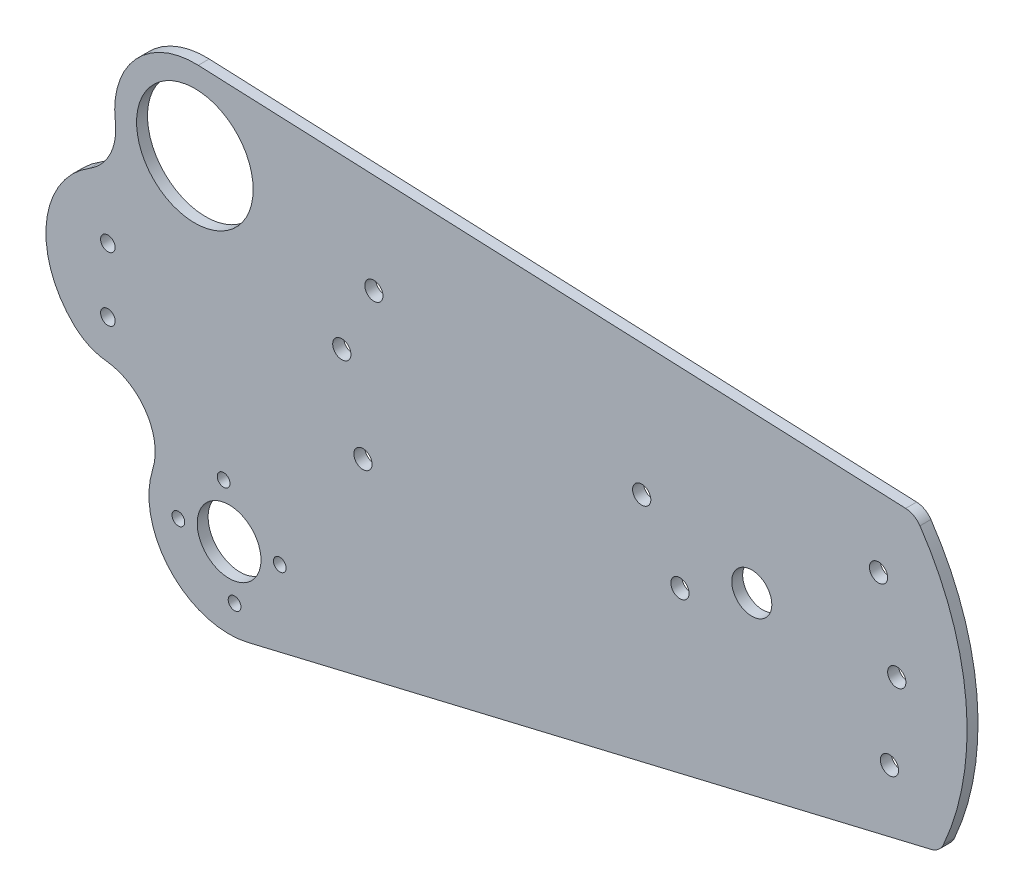
ISO-10303-21;
HEADER;
FILE_DESCRIPTION(('STEP AP214'),'2;1');
FILE_NAME('part.step','',(''),(''),'','','');
FILE_SCHEMA(('AUTOMOTIVE_DESIGN { 1 0 10303 214 1 1 1 1 }'));
ENDSEC;
DATA;
#1=APPLICATION_CONTEXT('core data for automotive mechanical design processes');
#2=APPLICATION_PROTOCOL_DEFINITION('international standard','automotive_design',2000,#1);
#3=PRODUCT_CONTEXT('',#1,'mechanical');
#4=PRODUCT('Part','Part','',(#3));
#5=PRODUCT_RELATED_PRODUCT_CATEGORY('part','',(#4));
#6=PRODUCT_DEFINITION_FORMATION('','',#4);
#7=PRODUCT_DEFINITION_CONTEXT('part definition',#1,'design');
#8=PRODUCT_DEFINITION('design','',#6,#7);
#9=PRODUCT_DEFINITION_SHAPE('','',#8);
#10=(LENGTH_UNIT() NAMED_UNIT(*) SI_UNIT(.MILLI.,.METRE.));
#11=(NAMED_UNIT(*) PLANE_ANGLE_UNIT() SI_UNIT($,.RADIAN.));
#12=(NAMED_UNIT(*) SI_UNIT($,.STERADIAN.) SOLID_ANGLE_UNIT());
#13=UNCERTAINTY_MEASURE_WITH_UNIT(LENGTH_MEASURE(1.E-05),#10,'distance_accuracy_value','');
#14=(GEOMETRIC_REPRESENTATION_CONTEXT(3) GLOBAL_UNCERTAINTY_ASSIGNED_CONTEXT((#13)) GLOBAL_UNIT_ASSIGNED_CONTEXT((#10,
#11,#12)) REPRESENTATION_CONTEXT('',''));
#15=CARTESIAN_POINT('',(0.,0.,0.));
#16=DIRECTION('',(0.,0.,1.));
#17=DIRECTION('',(1.,0.,0.));
#18=AXIS2_PLACEMENT_3D('',#15,#16,#17);
#19=CARTESIAN_POINT('',(1.89075570106414,44.5872079271914,3.));
#20=DIRECTION('',(0.0423677115411601,0.999102085384054,0.));
#21=DIRECTION('',(-0.999102085384054,0.0423677115411601,0.));
#22=AXIS2_PLACEMENT_3D('',#19,#20,#21);
#23=PLANE('',#22);
#24=DIRECTION('',(0.999102085384054,-0.0423677115411601,0.));
#25=VECTOR('',#24,1.);
#26=CARTESIAN_POINT('',(1.89075570106414,44.5872079271914,0.));
#27=LINE('',#26,#25);
#28=CARTESIAN_POINT('',(-113.495330616477,49.4802458784491,0.));
#29=VERTEX_POINT('',#28);
#30=CARTESIAN_POINT('',(80.6427526251226,41.247667415987,0.));
#31=VERTEX_POINT('',#30);
#32=EDGE_CURVE('E226',#29,#31,#27,.T.);
#33=ORIENTED_EDGE('',*,*,#32,.F.);
#34=DIRECTION('',(0.,0.,-1.));
#35=VECTOR('',#34,1.);
#36=CARTESIAN_POINT('',(-113.495330616477,49.4802458784491,3.));
#37=LINE('',#36,#35);
#38=CARTESIAN_POINT('',(-113.495330616477,49.4802458784491,3.));
#39=VERTEX_POINT('',#38);
#40=EDGE_CURVE('E11',#39,#29,#37,.T.);
#41=ORIENTED_EDGE('',*,*,#40,.F.);
#42=DIRECTION('',(0.999102085384054,-0.0423677115411601,0.));
#43=VECTOR('',#42,1.);
#44=CARTESIAN_POINT('',(1.89075570106414,44.5872079271914,3.));
#45=LINE('',#44,#43);
#46=CARTESIAN_POINT('',(80.6427526251226,41.247667415987,3.));
#47=VERTEX_POINT('',#46);
#48=EDGE_CURVE('E330',#39,#47,#45,.T.);
#49=ORIENTED_EDGE('',*,*,#48,.T.);
#50=DIRECTION('',(0.,0.,-1.));
#51=VECTOR('',#50,1.);
#52=CARTESIAN_POINT('',(80.6427526251226,41.247667415987,3.));
#53=LINE('',#52,#51);
#54=EDGE_CURVE('E102',#47,#31,#53,.T.);
#55=ORIENTED_EDGE('',*,*,#54,.T.);
#56=EDGE_LOOP('',(#33,#41,#49,#55));
#57=FACE_BOUND('',#56,.T.);
#58=ADVANCED_FACE('F41',(#57),#23,.T.);
#59=CARTESIAN_POINT('',(-114.427420270382,27.5,3.));
#60=DIRECTION('',(0.,0.,-1.));
#61=DIRECTION('',(-1.,0.,0.));
#62=AXIS2_PLACEMENT_3D('',#59,#60,#61);
#63=CYLINDRICAL_SURFACE('',#62,22.);
#64=CARTESIAN_POINT('',(-114.427420270382,27.5,0.));
#65=DIRECTION('',(0.,0.,1.));
#66=DIRECTION('',(1.,0.,0.));
#67=AXIS2_PLACEMENT_3D('',#64,#65,#66);
#68=CIRCLE('',#67,22.);
#69=CARTESIAN_POINT('',(-136.255917019938,24.7583345108093,0.));
#70=VERTEX_POINT('',#69);
#71=EDGE_CURVE('E230',#29,#70,#68,.T.);
#72=ORIENTED_EDGE('',*,*,#71,.T.);
#73=DIRECTION('',(0.,0.,-1.));
#74=VECTOR('',#73,1.);
#75=CARTESIAN_POINT('',(-136.255917019938,24.7583345108093,3.));
#76=LINE('',#75,#74);
#77=CARTESIAN_POINT('',(-136.255917019938,24.7583345108093,3.));
#78=VERTEX_POINT('',#77);
#79=EDGE_CURVE('E50',#78,#70,#76,.T.);
#80=ORIENTED_EDGE('',*,*,#79,.F.);
#81=CARTESIAN_POINT('',(-114.427420270382,27.5,3.));
#82=DIRECTION('',(0.,0.,1.));
#83=DIRECTION('',(1.,0.,0.));
#84=AXIS2_PLACEMENT_3D('',#81,#82,#83);
#85=CIRCLE('',#84,22.);
#86=EDGE_CURVE('E405',#39,#78,#85,.T.);
#87=ORIENTED_EDGE('',*,*,#86,.F.);
#88=ORIENTED_EDGE('',*,*,#40,.T.);
#89=EDGE_LOOP('',(#72,#80,#87,#88));
#90=FACE_BOUND('',#89,.T.);
#91=ADVANCED_FACE('F363',(#90),#63,.T.);
#92=CARTESIAN_POINT('',(-151.138982985545,22.8890171318156,3.));
#93=DIRECTION('',(0.,0.,-1.));
#94=DIRECTION('',(-1.,0.,0.));
#95=AXIS2_PLACEMENT_3D('',#92,#93,#94);
#96=CYLINDRICAL_SURFACE('',#95,15.);
#97=CARTESIAN_POINT('',(-151.138982985545,22.8890171318156,0.));
#98=DIRECTION('',(0.,0.,1.));
#99=DIRECTION('',(1.,0.,0.));
#100=AXIS2_PLACEMENT_3D('',#97,#98,#99);
#101=CIRCLE('',#100,15.);
#102=CARTESIAN_POINT('',(-143.326375164213,10.0842071359562,0.));
#103=VERTEX_POINT('',#102);
#104=EDGE_CURVE('E234',#103,#70,#101,.T.);
#105=ORIENTED_EDGE('',*,*,#104,.F.);
#106=DIRECTION('',(0.,0.,-1.));
#107=VECTOR('',#106,1.);
#108=CARTESIAN_POINT('',(-143.326375164213,10.0842071359562,3.));
#109=LINE('',#108,#107);
#110=CARTESIAN_POINT('',(-143.326375164213,10.0842071359562,3.));
#111=VERTEX_POINT('',#110);
#112=EDGE_CURVE('E351',#111,#103,#109,.T.);
#113=ORIENTED_EDGE('',*,*,#112,.F.);
#114=CARTESIAN_POINT('',(-151.138982985545,22.8890171318156,3.));
#115=DIRECTION('',(0.,0.,1.));
#116=DIRECTION('',(1.,0.,0.));
#117=AXIS2_PLACEMENT_3D('',#114,#115,#116);
#118=CIRCLE('',#117,15.);
#119=EDGE_CURVE('E360',#111,#78,#118,.T.);
#120=ORIENTED_EDGE('',*,*,#119,.T.);
#121=ORIENTED_EDGE('',*,*,#79,.T.);
#122=EDGE_LOOP('',(#105,#113,#120,#121));
#123=FACE_BOUND('',#122,.T.);
#124=ADVANCED_FACE('F358',(#123),#96,.F.);
#125=CARTESIAN_POINT('',(-130.305362128659,-11.2571428571429,3.));
#126=DIRECTION('',(0.,0.,-1.));
#127=DIRECTION('',(-1.,0.,0.));
#128=AXIS2_PLACEMENT_3D('',#125,#126,#127);
#129=CYLINDRICAL_SURFACE('',#128,25.);
#130=CARTESIAN_POINT('',(-130.305362128659,-11.2571428571429,0.));
#131=DIRECTION('',(0.,0.,1.));
#132=DIRECTION('',(1.,0.,0.));
#133=AXIS2_PLACEMENT_3D('',#130,#131,#132);
#134=CIRCLE('',#133,25.);
#135=CARTESIAN_POINT('',(-147.542861296201,-29.3642857142857,0.));
#136=VERTEX_POINT('',#135);
#137=EDGE_CURVE('E238',#103,#136,#134,.T.);
#138=ORIENTED_EDGE('',*,*,#137,.T.);
#139=DIRECTION('',(0.,0.,-1.));
#140=VECTOR('',#139,1.);
#141=CARTESIAN_POINT('',(-147.542861296201,-29.3642857142857,3.));
#142=LINE('',#141,#140);
#143=CARTESIAN_POINT('',(-147.542861296201,-29.3642857142857,3.));
#144=VERTEX_POINT('',#143);
#145=EDGE_CURVE('E347',#144,#136,#142,.T.);
#146=ORIENTED_EDGE('',*,*,#145,.F.);
#147=CARTESIAN_POINT('',(-130.305362128659,-11.2571428571429,3.));
#148=DIRECTION('',(0.,0.,1.));
#149=DIRECTION('',(1.,0.,0.));
#150=AXIS2_PLACEMENT_3D('',#147,#148,#149);
#151=CIRCLE('',#150,25.);
#152=EDGE_CURVE('E382',#111,#144,#151,.T.);
#153=ORIENTED_EDGE('',*,*,#152,.F.);
#154=ORIENTED_EDGE('',*,*,#112,.T.);
#155=EDGE_LOOP('',(#138,#146,#153,#154));
#156=FACE_BOUND('',#155,.T.);
#157=ADVANCED_FACE('F371',(#156),#129,.T.);
#158=CARTESIAN_POINT('',(-137.200361795676,-18.5,3.));
#159=DIRECTION('',(0.,0.,-1.));
#160=DIRECTION('',(-1.,0.,0.));
#161=AXIS2_PLACEMENT_3D('',#158,#159,#160);
#162=CYLINDRICAL_SURFACE('',#161,15.);
#163=CARTESIAN_POINT('',(-137.200361795676,-18.5,0.));
#164=DIRECTION('',(0.,0.,1.));
#165=DIRECTION('',(1.,0.,0.));
#166=AXIS2_PLACEMENT_3D('',#163,#164,#165);
#167=CIRCLE('',#166,15.);
#168=CARTESIAN_POINT('',(-138.755800816739,-33.4191356804527,0.));
#169=VERTEX_POINT('',#168);
#170=EDGE_CURVE('E241',#136,#169,#167,.T.);
#171=ORIENTED_EDGE('',*,*,#170,.T.);
#172=DIRECTION('',(0.,0.,-1.));
#173=VECTOR('',#172,1.);
#174=CARTESIAN_POINT('',(-138.755800816739,-33.4191356804527,3.));
#175=LINE('',#174,#173);
#176=CARTESIAN_POINT('',(-138.755800816739,-33.4191356804527,3.));
#177=VERTEX_POINT('',#176);
#178=EDGE_CURVE('E344',#177,#169,#175,.T.);
#179=ORIENTED_EDGE('',*,*,#178,.F.);
#180=CARTESIAN_POINT('',(-137.200361795676,-18.5,3.));
#181=DIRECTION('',(0.,0.,1.));
#182=DIRECTION('',(1.,0.,0.));
#183=AXIS2_PLACEMENT_3D('',#180,#181,#182);
#184=CIRCLE('',#183,15.);
#185=EDGE_CURVE('E377',#144,#177,#184,.T.);
#186=ORIENTED_EDGE('',*,*,#185,.F.);
#187=ORIENTED_EDGE('',*,*,#145,.T.);
#188=EDGE_LOOP('',(#171,#179,#186,#187));
#189=FACE_BOUND('',#188,.T.);
#190=ADVANCED_FACE('F375',(#189),#162,.T.);
#191=CARTESIAN_POINT('',(-140.311239837801,-48.3382713609054,3.));
#192=DIRECTION('',(0.,0.,-1.));
#193=DIRECTION('',(-1.,0.,0.));
#194=AXIS2_PLACEMENT_3D('',#191,#192,#193);
#195=CYLINDRICAL_SURFACE('',#194,15.);
#196=CARTESIAN_POINT('',(-140.311239837801,-48.3382713609054,0.));
#197=DIRECTION('',(0.,0.,1.));
#198=DIRECTION('',(1.,0.,0.));
#199=AXIS2_PLACEMENT_3D('',#196,#197,#198);
#200=CIRCLE('',#199,15.);
#201=CARTESIAN_POINT('',(-126.009307034558,-52.8609606152688,0.));
#202=VERTEX_POINT('',#201);
#203=EDGE_CURVE('E245',#202,#169,#200,.T.);
#204=ORIENTED_EDGE('',*,*,#203,.F.);
#205=DIRECTION('',(0.,0.,-1.));
#206=VECTOR('',#205,1.);
#207=CARTESIAN_POINT('',(-126.009307034558,-52.8609606152688,3.));
#208=LINE('',#207,#206);
#209=CARTESIAN_POINT('',(-126.009307034558,-52.8609606152688,3.));
#210=VERTEX_POINT('',#209);
#211=EDGE_CURVE('E341',#210,#202,#208,.T.);
#212=ORIENTED_EDGE('',*,*,#211,.F.);
#213=CARTESIAN_POINT('',(-140.311239837801,-48.3382713609054,3.));
#214=DIRECTION('',(0.,0.,1.));
#215=DIRECTION('',(1.,0.,0.));
#216=AXIS2_PLACEMENT_3D('',#213,#214,#215);
#217=CIRCLE('',#216,15.);
#218=EDGE_CURVE('E381',#210,#177,#217,.T.);
#219=ORIENTED_EDGE('',*,*,#218,.T.);
#220=ORIENTED_EDGE('',*,*,#178,.T.);
#221=EDGE_LOOP('',(#204,#212,#219,#220));
#222=FACE_BOUND('',#221,.T.);
#223=ADVANCED_FACE('F423',(#222),#195,.F.);
#224=CARTESIAN_POINT('',(-105.033138923136,-59.4942381883351,3.));
#225=DIRECTION('',(0.,0.,-1.));
#226=DIRECTION('',(-1.,0.,0.));
#227=AXIS2_PLACEMENT_3D('',#224,#225,#226);
#228=CYLINDRICAL_SURFACE('',#227,22.);
#229=CARTESIAN_POINT('',(-105.033138923136,-59.4942381883351,0.));
#230=DIRECTION('',(0.,0.,1.));
#231=DIRECTION('',(1.,0.,0.));
#232=AXIS2_PLACEMENT_3D('',#229,#230,#231);
#233=CIRCLE('',#232,22.);
#234=CARTESIAN_POINT('',(-99.9461169670031,-80.8980277504156,0.));
#235=VERTEX_POINT('',#234);
#236=EDGE_CURVE('E249',#202,#235,#233,.T.);
#237=ORIENTED_EDGE('',*,*,#236,.T.);
#238=DIRECTION('',(0.,0.,-1.));
#239=VECTOR('',#238,1.);
#240=CARTESIAN_POINT('',(-99.9461169670031,-80.8980277504156,3.));
#241=LINE('',#240,#239);
#242=CARTESIAN_POINT('',(-99.9461169670031,-80.8980277504156,3.));
#243=VERTEX_POINT('',#242);
#244=EDGE_CURVE('E337',#243,#235,#241,.T.);
#245=ORIENTED_EDGE('',*,*,#244,.F.);
#246=CARTESIAN_POINT('',(-105.033138923136,-59.4942381883351,3.));
#247=DIRECTION('',(0.,0.,1.));
#248=DIRECTION('',(1.,0.,0.));
#249=AXIS2_PLACEMENT_3D('',#246,#247,#248);
#250=CIRCLE('',#249,22.);
#251=EDGE_CURVE('E386',#210,#243,#250,.T.);
#252=ORIENTED_EDGE('',*,*,#251,.F.);
#253=ORIENTED_EDGE('',*,*,#211,.T.);
#254=EDGE_LOOP('',(#237,#245,#252,#253));
#255=FACE_BOUND('',#254,.T.);
#256=ADVANCED_FACE('F396',(#255),#228,.T.);
#257=CARTESIAN_POINT('',(12.8552016168976,-54.0886264220804,3.));
#258=DIRECTION('',(-0.231228270733313,0.972899525549109,0.));
#259=DIRECTION('',(-0.972899525549109,-0.231228270733313,0.));
#260=AXIS2_PLACEMENT_3D('',#257,#258,#259);
#261=PLANE('',#260);
#262=DIRECTION('',(0.972899525549109,0.231228270733313,0.));
#263=VECTOR('',#262,1.);
#264=CARTESIAN_POINT('',(12.8552016168976,-54.0886264220804,0.));
#265=LINE('',#264,#263);
#266=CARTESIAN_POINT('',(87.5903948132662,-36.3263713978908,0.));
#267=VERTEX_POINT('',#266);
#268=EDGE_CURVE('E252',#235,#267,#265,.T.);
#269=ORIENTED_EDGE('',*,*,#268,.T.);
#270=DIRECTION('',(0.,0.,-1.));
#271=VECTOR('',#270,1.);
#272=CARTESIAN_POINT('',(87.5903948132662,-36.3263713978908,3.));
#273=LINE('',#272,#271);
#274=CARTESIAN_POINT('',(87.5903948132662,-36.3263713978908,3.));
#275=VERTEX_POINT('',#274);
#276=EDGE_CURVE('E148',#275,#267,#273,.T.);
#277=ORIENTED_EDGE('',*,*,#276,.F.);
#278=DIRECTION('',(0.972899525549109,0.231228270733313,0.));
#279=VECTOR('',#278,1.);
#280=CARTESIAN_POINT('',(12.8552016168976,-54.0886264220804,3.));
#281=LINE('',#280,#279);
#282=EDGE_CURVE('E137',#243,#275,#281,.T.);
#283=ORIENTED_EDGE('',*,*,#282,.F.);
#284=ORIENTED_EDGE('',*,*,#244,.T.);
#285=EDGE_LOOP('',(#269,#277,#283,#284));
#286=FACE_BOUND('',#285,.T.);
#287=ADVANCED_FACE('F400',(#286),#261,.F.);
#288=CARTESIAN_POINT('',(86.4342534595996,-31.4618737701452,3.));
#289=DIRECTION('',(0.,0.,-1.));
#290=DIRECTION('',(-1.,0.,0.));
#291=AXIS2_PLACEMENT_3D('',#288,#289,#290);
#292=CYLINDRICAL_SURFACE('',#291,5.00000000000001);
#293=CARTESIAN_POINT('',(86.4342534595996,-31.4618737701452,0.));
#294=DIRECTION('',(0.,0.,1.));
#295=DIRECTION('',(1.,0.,0.));
#296=AXIS2_PLACEMENT_3D('',#293,#294,#295);
#297=CIRCLE('',#296,5.00000000000001);
#298=CARTESIAN_POINT('',(91.,-33.5,0.));
#299=VERTEX_POINT('',#298);
#300=EDGE_CURVE('E146',#267,#299,#297,.T.);
#301=ORIENTED_EDGE('',*,*,#300,.T.);
#302=DIRECTION('',(0.,0.,-1.));
#303=VECTOR('',#302,1.);
#304=CARTESIAN_POINT('',(91.,-33.5,3.));
#305=LINE('',#304,#303);
#306=CARTESIAN_POINT('',(91.,-33.5,3.));
#307=VERTEX_POINT('',#306);
#308=EDGE_CURVE('E143',#307,#299,#305,.T.);
#309=ORIENTED_EDGE('',*,*,#308,.F.);
#310=CARTESIAN_POINT('',(86.4342534595996,-31.4618737701452,3.));
#311=DIRECTION('',(0.,0.,1.));
#312=DIRECTION('',(1.,0.,0.));
#313=AXIS2_PLACEMENT_3D('',#310,#311,#312);
#314=CIRCLE('',#313,5.00000000000001);
#315=EDGE_CURVE('E130',#275,#307,#314,.T.);
#316=ORIENTED_EDGE('',*,*,#315,.F.);
#317=ORIENTED_EDGE('',*,*,#276,.T.);
#318=EDGE_LOOP('',(#301,#309,#316,#317));
#319=FACE_BOUND('',#318,.T.);
#320=ADVANCED_FACE('F144',(#319),#292,.T.);
#321=CARTESIAN_POINT('',(22.6589151875398,-2.99288439458776,3.));
#322=DIRECTION('',(0.,0.,-1.));
#323=DIRECTION('',(-1.,0.,0.));
#324=AXIS2_PLACEMENT_3D('',#321,#322,#323);
#325=CYLINDRICAL_SURFACE('',#324,74.8410848124603);
#326=CARTESIAN_POINT('',(22.6589151875398,-2.99288439458776,0.));
#327=DIRECTION('',(0.,0.,1.));
#328=DIRECTION('',(1.,0.,0.));
#329=AXIS2_PLACEMENT_3D('',#326,#327,#328);
#330=CIRCLE('',#329,74.8410848124603);
#331=CARTESIAN_POINT('',(84.5668749445287,39.0617526224275,0.));
#332=VERTEX_POINT('',#331);
#333=EDGE_CURVE('E95',#299,#332,#330,.T.);
#334=ORIENTED_EDGE('',*,*,#333,.T.);
#335=DIRECTION('',(0.,0.,-1.));
#336=VECTOR('',#335,1.);
#337=CARTESIAN_POINT('',(84.5668749445287,39.0617526224275,3.));
#338=LINE('',#337,#336);
#339=CARTESIAN_POINT('',(84.5668749445287,39.0617526224275,3.));
#340=VERTEX_POINT('',#339);
#341=EDGE_CURVE('E149',#340,#332,#338,.T.);
#342=ORIENTED_EDGE('',*,*,#341,.F.);
#343=CARTESIAN_POINT('',(22.6589151875398,-2.99288439458776,3.));
#344=DIRECTION('',(0.,0.,1.));
#345=DIRECTION('',(1.,0.,0.));
#346=AXIS2_PLACEMENT_3D('',#343,#344,#345);
#347=CIRCLE('',#346,74.8410848124603);
#348=EDGE_CURVE('E135',#307,#340,#347,.T.);
#349=ORIENTED_EDGE('',*,*,#348,.F.);
#350=ORIENTED_EDGE('',*,*,#308,.T.);
#351=EDGE_LOOP('',(#334,#342,#349,#350));
#352=FACE_BOUND('',#351,.T.);
#353=ADVANCED_FACE('F151',(#352),#325,.T.);
#354=CARTESIAN_POINT('',(-103.530053907577,-73.4133162984688,3.));
#355=DIRECTION('',(0.,0.,-1.));
#356=DIRECTION('',(-1.,0.,0.));
#357=AXIS2_PLACEMENT_3D('',#354,#355,#356);
#358=CYLINDRICAL_SURFACE('',#357,1.75);
#359=CARTESIAN_POINT('',(-103.530053907577,-73.4133162984688,3.));
#360=DIRECTION('',(0.,0.,1.));
#361=DIRECTION('',(1.,0.,0.));
#362=AXIS2_PLACEMENT_3D('',#359,#360,#361);
#363=CIRCLE('',#362,1.75);
#364=CARTESIAN_POINT('',(-101.780053907577,-73.4133162984688,3.));
#365=VERTEX_POINT('',#364);
#366=EDGE_CURVE('E218',#365,#365,#363,.T.);
#367=ORIENTED_EDGE('',*,*,#366,.T.);
#368=EDGE_LOOP('',(#367));
#369=FACE_BOUND('',#368,.T.);
#370=CARTESIAN_POINT('',(-103.530053907577,-73.4133162984688,0.));
#371=DIRECTION('',(0.,0.,1.));
#372=DIRECTION('',(1.,0.,0.));
#373=AXIS2_PLACEMENT_3D('',#370,#371,#372);
#374=CIRCLE('',#373,1.75);
#375=CARTESIAN_POINT('',(-101.780053907577,-73.4133162984688,0.));
#376=VERTEX_POINT('',#375);
#377=EDGE_CURVE('E322',#376,#376,#374,.T.);
#378=ORIENTED_EDGE('',*,*,#377,.F.);
#379=EDGE_LOOP('',(#378));
#380=FACE_BOUND('',#379,.T.);
#381=ADVANCED_FACE('F435',(#369,#380),#358,.F.);
#382=CARTESIAN_POINT('',(-91.1140608130024,-57.9911531727758,3.));
#383=DIRECTION('',(0.,0.,-1.));
#384=DIRECTION('',(-1.,0.,0.));
#385=AXIS2_PLACEMENT_3D('',#382,#383,#384);
#386=CYLINDRICAL_SURFACE('',#385,1.74999999999997);
#387=CARTESIAN_POINT('',(-91.1140608130024,-57.9911531727758,3.));
#388=DIRECTION('',(0.,0.,1.));
#389=DIRECTION('',(1.,0.,0.));
#390=AXIS2_PLACEMENT_3D('',#387,#388,#389);
#391=CIRCLE('',#390,1.74999999999997);
#392=CARTESIAN_POINT('',(-89.3640608130025,-57.9911531727758,3.));
#393=VERTEX_POINT('',#392);
#394=EDGE_CURVE('E214',#393,#393,#391,.T.);
#395=ORIENTED_EDGE('',*,*,#394,.T.);
#396=EDGE_LOOP('',(#395));
#397=FACE_BOUND('',#396,.T.);
#398=CARTESIAN_POINT('',(-91.1140608130024,-57.9911531727758,0.));
#399=DIRECTION('',(0.,0.,1.));
#400=DIRECTION('',(1.,0.,0.));
#401=AXIS2_PLACEMENT_3D('',#398,#399,#400);
#402=CIRCLE('',#401,1.74999999999997);
#403=CARTESIAN_POINT('',(-89.3640608130025,-57.9911531727758,0.));
#404=VERTEX_POINT('',#403);
#405=EDGE_CURVE('E318',#404,#404,#402,.T.);
#406=ORIENTED_EDGE('',*,*,#405,.F.);
#407=EDGE_LOOP('',(#406));
#408=FACE_BOUND('',#407,.T.);
#409=ADVANCED_FACE('F494',(#397,#408),#386,.F.);
#410=CARTESIAN_POINT('',(-106.536223938695,-45.5751600782015,3.));
#411=DIRECTION('',(0.,0.,-1.));
#412=DIRECTION('',(-1.,0.,0.));
#413=AXIS2_PLACEMENT_3D('',#410,#411,#412);
#414=CYLINDRICAL_SURFACE('',#413,1.74999999999998);
#415=CARTESIAN_POINT('',(-106.536223938695,-45.5751600782015,3.));
#416=DIRECTION('',(0.,0.,1.));
#417=DIRECTION('',(1.,0.,0.));
#418=AXIS2_PLACEMENT_3D('',#415,#416,#417);
#419=CIRCLE('',#418,1.74999999999998);
#420=CARTESIAN_POINT('',(-104.786223938695,-45.5751600782015,3.));
#421=VERTEX_POINT('',#420);
#422=EDGE_CURVE('E210',#421,#421,#419,.T.);
#423=ORIENTED_EDGE('',*,*,#422,.T.);
#424=EDGE_LOOP('',(#423));
#425=FACE_BOUND('',#424,.T.);
#426=CARTESIAN_POINT('',(-106.536223938695,-45.5751600782015,0.));
#427=DIRECTION('',(0.,0.,1.));
#428=DIRECTION('',(1.,0.,0.));
#429=AXIS2_PLACEMENT_3D('',#426,#427,#428);
#430=CIRCLE('',#429,1.74999999999998);
#431=CARTESIAN_POINT('',(-104.786223938695,-45.5751600782015,0.));
#432=VERTEX_POINT('',#431);
#433=EDGE_CURVE('E314',#432,#432,#430,.T.);
#434=ORIENTED_EDGE('',*,*,#433,.F.);
#435=EDGE_LOOP('',(#434));
#436=FACE_BOUND('',#435,.T.);
#437=ADVANCED_FACE('F490',(#425,#436),#414,.F.);
#438=CARTESIAN_POINT('',(-105.033138923136,-59.4942381883351,3.));
#439=DIRECTION('',(0.,0.,-1.));
#440=DIRECTION('',(-1.,0.,0.));
#441=AXIS2_PLACEMENT_3D('',#438,#439,#440);
#442=CYLINDRICAL_SURFACE('',#441,8.75000000000001);
#443=CARTESIAN_POINT('',(-105.033138923136,-59.4942381883351,3.));
#444=DIRECTION('',(0.,0.,1.));
#445=DIRECTION('',(1.,0.,0.));
#446=AXIS2_PLACEMENT_3D('',#443,#444,#445);
#447=CIRCLE('',#446,8.75000000000001);
#448=CARTESIAN_POINT('',(-96.283138923136,-59.4942381883351,3.));
#449=VERTEX_POINT('',#448);
#450=EDGE_CURVE('E206',#449,#449,#447,.T.);
#451=ORIENTED_EDGE('',*,*,#450,.T.);
#452=EDGE_LOOP('',(#451));
#453=FACE_BOUND('',#452,.T.);
#454=CARTESIAN_POINT('',(-105.033138923136,-59.4942381883351,0.));
#455=DIRECTION('',(0.,0.,1.));
#456=DIRECTION('',(1.,0.,0.));
#457=AXIS2_PLACEMENT_3D('',#454,#455,#456);
#458=CIRCLE('',#457,8.75000000000001);
#459=CARTESIAN_POINT('',(-96.283138923136,-59.4942381883351,0.));
#460=VERTEX_POINT('',#459);
#461=EDGE_CURVE('E310',#460,#460,#458,.T.);
#462=ORIENTED_EDGE('',*,*,#461,.F.);
#463=EDGE_LOOP('',(#462));
#464=FACE_BOUND('',#463,.T.);
#465=ADVANCED_FACE('F486',(#453,#464),#442,.F.);
#466=CARTESIAN_POINT('',(-114.427420270382,27.5,3.));
#467=DIRECTION('',(0.,0.,-1.));
#468=DIRECTION('',(-1.,0.,0.));
#469=AXIS2_PLACEMENT_3D('',#466,#467,#468);
#470=CYLINDRICAL_SURFACE('',#469,16.);
#471=CARTESIAN_POINT('',(-114.427420270382,27.5,3.));
#472=DIRECTION('',(0.,0.,1.));
#473=DIRECTION('',(1.,0.,0.));
#474=AXIS2_PLACEMENT_3D('',#471,#472,#473);
#475=CIRCLE('',#474,16.);
#476=CARTESIAN_POINT('',(-98.427420270382,27.5,3.));
#477=VERTEX_POINT('',#476);
#478=EDGE_CURVE('E202',#477,#477,#475,.T.);
#479=ORIENTED_EDGE('',*,*,#478,.T.);
#480=EDGE_LOOP('',(#479));
#481=FACE_BOUND('',#480,.T.);
#482=CARTESIAN_POINT('',(-114.427420270382,27.5,0.));
#483=DIRECTION('',(0.,0.,1.));
#484=DIRECTION('',(1.,0.,0.));
#485=AXIS2_PLACEMENT_3D('',#482,#483,#484);
#486=CIRCLE('',#485,16.);
#487=CARTESIAN_POINT('',(-98.427420270382,27.5,0.));
#488=VERTEX_POINT('',#487);
#489=EDGE_CURVE('E306',#488,#488,#486,.T.);
#490=ORIENTED_EDGE('',*,*,#489,.F.);
#491=EDGE_LOOP('',(#490));
#492=FACE_BOUND('',#491,.T.);
#493=ADVANCED_FACE('F482',(#481,#492),#470,.F.);
#494=CARTESIAN_POINT('',(-68.3,-21.5,3.));
#495=DIRECTION('',(0.,0.,-1.));
#496=DIRECTION('',(-1.,0.,0.));
#497=AXIS2_PLACEMENT_3D('',#494,#495,#496);
#498=CYLINDRICAL_SURFACE('',#497,2.49999999999999);
#499=CARTESIAN_POINT('',(-68.3,-21.5,3.));
#500=DIRECTION('',(0.,0.,1.));
#501=DIRECTION('',(1.,0.,0.));
#502=AXIS2_PLACEMENT_3D('',#499,#500,#501);
#503=CIRCLE('',#502,2.49999999999999);
#504=CARTESIAN_POINT('',(-65.8,-21.5,3.));
#505=VERTEX_POINT('',#504);
#506=EDGE_CURVE('E198',#505,#505,#503,.T.);
#507=ORIENTED_EDGE('',*,*,#506,.T.);
#508=EDGE_LOOP('',(#507));
#509=FACE_BOUND('',#508,.T.);
#510=CARTESIAN_POINT('',(-68.3,-21.5,0.));
#511=DIRECTION('',(0.,0.,1.));
#512=DIRECTION('',(1.,0.,0.));
#513=AXIS2_PLACEMENT_3D('',#510,#511,#512);
#514=CIRCLE('',#513,2.49999999999999);
#515=CARTESIAN_POINT('',(-65.8,-21.5,0.));
#516=VERTEX_POINT('',#515);
#517=EDGE_CURVE('E302',#516,#516,#514,.T.);
#518=ORIENTED_EDGE('',*,*,#517,.F.);
#519=EDGE_LOOP('',(#518));
#520=FACE_BOUND('',#519,.T.);
#521=ADVANCED_FACE('F478',(#509,#520),#498,.F.);
#522=CARTESIAN_POINT('',(-138.3,-5.25000000000004,3.));
#523=DIRECTION('',(0.,0.,-1.));
#524=DIRECTION('',(-1.,0.,0.));
#525=AXIS2_PLACEMENT_3D('',#522,#523,#524);
#526=CYLINDRICAL_SURFACE('',#525,2.);
#527=CARTESIAN_POINT('',(-138.3,-5.25000000000004,3.));
#528=DIRECTION('',(0.,0.,1.));
#529=DIRECTION('',(1.,0.,0.));
#530=AXIS2_PLACEMENT_3D('',#527,#528,#529);
#531=CIRCLE('',#530,2.);
#532=CARTESIAN_POINT('',(-136.3,-5.25000000000004,3.));
#533=VERTEX_POINT('',#532);
#534=EDGE_CURVE('E194',#533,#533,#531,.T.);
#535=ORIENTED_EDGE('',*,*,#534,.T.);
#536=EDGE_LOOP('',(#535));
#537=FACE_BOUND('',#536,.T.);
#538=CARTESIAN_POINT('',(-138.3,-5.25000000000004,0.));
#539=DIRECTION('',(0.,0.,1.));
#540=DIRECTION('',(1.,0.,0.));
#541=AXIS2_PLACEMENT_3D('',#538,#539,#540);
#542=CIRCLE('',#541,2.);
#543=CARTESIAN_POINT('',(-136.3,-5.25000000000004,0.));
#544=VERTEX_POINT('',#543);
#545=EDGE_CURVE('E298',#544,#544,#542,.T.);
#546=ORIENTED_EDGE('',*,*,#545,.F.);
#547=EDGE_LOOP('',(#546));
#548=FACE_BOUND('',#547,.T.);
#549=ADVANCED_FACE('F474',(#537,#548),#526,.F.);
#550=CARTESIAN_POINT('',(-138.3,-22.75,3.));
#551=DIRECTION('',(0.,0.,-1.));
#552=DIRECTION('',(-1.,0.,0.));
#553=AXIS2_PLACEMENT_3D('',#550,#551,#552);
#554=CYLINDRICAL_SURFACE('',#553,2.);
#555=CARTESIAN_POINT('',(-138.3,-22.75,3.));
#556=DIRECTION('',(0.,0.,1.));
#557=DIRECTION('',(1.,0.,0.));
#558=AXIS2_PLACEMENT_3D('',#555,#556,#557);
#559=CIRCLE('',#558,2.);
#560=CARTESIAN_POINT('',(-136.3,-22.75,3.));
#561=VERTEX_POINT('',#560);
#562=EDGE_CURVE('E190',#561,#561,#559,.T.);
#563=ORIENTED_EDGE('',*,*,#562,.T.);
#564=EDGE_LOOP('',(#563));
#565=FACE_BOUND('',#564,.T.);
#566=CARTESIAN_POINT('',(-138.3,-22.75,0.));
#567=DIRECTION('',(0.,0.,1.));
#568=DIRECTION('',(1.,0.,0.));
#569=AXIS2_PLACEMENT_3D('',#566,#567,#568);
#570=CIRCLE('',#569,2.);
#571=CARTESIAN_POINT('',(-136.3,-22.75,0.));
#572=VERTEX_POINT('',#571);
#573=EDGE_CURVE('E294',#572,#572,#570,.T.);
#574=ORIENTED_EDGE('',*,*,#573,.F.);
#575=EDGE_LOOP('',(#574));
#576=FACE_BOUND('',#575,.T.);
#577=ADVANCED_FACE('F470',(#565,#576),#554,.F.);
#578=CARTESIAN_POINT('',(-74.1,1.7,3.));
#579=DIRECTION('',(0.,0.,-1.));
#580=DIRECTION('',(-1.,0.,0.));
#581=AXIS2_PLACEMENT_3D('',#578,#579,#580);
#582=CYLINDRICAL_SURFACE('',#581,2.49999999999999);
#583=CARTESIAN_POINT('',(-74.1,1.7,3.));
#584=DIRECTION('',(0.,0.,1.));
#585=DIRECTION('',(1.,0.,0.));
#586=AXIS2_PLACEMENT_3D('',#583,#584,#585);
#587=CIRCLE('',#586,2.49999999999999);
#588=CARTESIAN_POINT('',(-71.6,1.7,3.));
#589=VERTEX_POINT('',#588);
#590=EDGE_CURVE('E186',#589,#589,#587,.T.);
#591=ORIENTED_EDGE('',*,*,#590,.T.);
#592=EDGE_LOOP('',(#591));
#593=FACE_BOUND('',#592,.T.);
#594=CARTESIAN_POINT('',(-74.1,1.7,0.));
#595=DIRECTION('',(0.,0.,1.));
#596=DIRECTION('',(1.,0.,0.));
#597=AXIS2_PLACEMENT_3D('',#594,#595,#596);
#598=CIRCLE('',#597,2.49999999999999);
#599=CARTESIAN_POINT('',(-71.6,1.7,0.));
#600=VERTEX_POINT('',#599);
#601=EDGE_CURVE('E290',#600,#600,#598,.T.);
#602=ORIENTED_EDGE('',*,*,#601,.F.);
#603=EDGE_LOOP('',(#602));
#604=FACE_BOUND('',#603,.T.);
#605=ADVANCED_FACE('F466',(#593,#604),#582,.F.);
#606=CARTESIAN_POINT('',(-65.3,20.,3.));
#607=DIRECTION('',(0.,0.,-1.));
#608=DIRECTION('',(-1.,0.,0.));
#609=AXIS2_PLACEMENT_3D('',#606,#607,#608);
#610=CYLINDRICAL_SURFACE('',#609,2.50000000000001);
#611=CARTESIAN_POINT('',(-65.3,20.,3.));
#612=DIRECTION('',(0.,0.,1.));
#613=DIRECTION('',(1.,0.,0.));
#614=AXIS2_PLACEMENT_3D('',#611,#612,#613);
#615=CIRCLE('',#614,2.50000000000001);
#616=CARTESIAN_POINT('',(-62.8,20.,3.));
#617=VERTEX_POINT('',#616);
#618=EDGE_CURVE('E182',#617,#617,#615,.T.);
#619=ORIENTED_EDGE('',*,*,#618,.T.);
#620=EDGE_LOOP('',(#619));
#621=FACE_BOUND('',#620,.T.);
#622=CARTESIAN_POINT('',(-65.3,20.,0.));
#623=DIRECTION('',(0.,0.,1.));
#624=DIRECTION('',(1.,0.,0.));
#625=AXIS2_PLACEMENT_3D('',#622,#623,#624);
#626=CIRCLE('',#625,2.50000000000001);
#627=CARTESIAN_POINT('',(-62.8,20.,0.));
#628=VERTEX_POINT('',#627);
#629=EDGE_CURVE('E286',#628,#628,#626,.T.);
#630=ORIENTED_EDGE('',*,*,#629,.F.);
#631=EDGE_LOOP('',(#630));
#632=FACE_BOUND('',#631,.T.);
#633=ADVANCED_FACE('F462',(#621,#632),#610,.F.);
#634=CARTESIAN_POINT('',(73.2,22.3,3.));
#635=DIRECTION('',(0.,0.,-1.));
#636=DIRECTION('',(-1.,0.,0.));
#637=AXIS2_PLACEMENT_3D('',#634,#635,#636);
#638=CYLINDRICAL_SURFACE('',#637,2.50000000000001);
#639=CARTESIAN_POINT('',(73.2,22.3,3.));
#640=DIRECTION('',(0.,0.,1.));
#641=DIRECTION('',(1.,0.,0.));
#642=AXIS2_PLACEMENT_3D('',#639,#640,#641);
#643=CIRCLE('',#642,2.50000000000001);
#644=CARTESIAN_POINT('',(75.7000000000001,22.3,3.));
#645=VERTEX_POINT('',#644);
#646=EDGE_CURVE('E178',#645,#645,#643,.T.);
#647=ORIENTED_EDGE('',*,*,#646,.T.);
#648=EDGE_LOOP('',(#647));
#649=FACE_BOUND('',#648,.T.);
#650=CARTESIAN_POINT('',(73.2,22.3,0.));
#651=DIRECTION('',(0.,0.,1.));
#652=DIRECTION('',(1.,0.,0.));
#653=AXIS2_PLACEMENT_3D('',#650,#651,#652);
#654=CIRCLE('',#653,2.50000000000001);
#655=CARTESIAN_POINT('',(75.7000000000001,22.3,0.));
#656=VERTEX_POINT('',#655);
#657=EDGE_CURVE('E282',#656,#656,#654,.T.);
#658=ORIENTED_EDGE('',*,*,#657,.F.);
#659=EDGE_LOOP('',(#658));
#660=FACE_BOUND('',#659,.T.);
#661=ADVANCED_FACE('F458',(#649,#660),#638,.F.);
#662=CARTESIAN_POINT('',(78.2,-0.100000000000003,3.));
#663=DIRECTION('',(0.,0.,-1.));
#664=DIRECTION('',(-1.,0.,0.));
#665=AXIS2_PLACEMENT_3D('',#662,#663,#664);
#666=CYLINDRICAL_SURFACE('',#665,2.5);
#667=CARTESIAN_POINT('',(78.2,-0.100000000000003,3.));
#668=DIRECTION('',(0.,0.,1.));
#669=DIRECTION('',(1.,0.,0.));
#670=AXIS2_PLACEMENT_3D('',#667,#668,#669);
#671=CIRCLE('',#670,2.5);
#672=CARTESIAN_POINT('',(80.7,-0.100000000000003,3.));
#673=VERTEX_POINT('',#672);
#674=EDGE_CURVE('E174',#673,#673,#671,.T.);
#675=ORIENTED_EDGE('',*,*,#674,.T.);
#676=EDGE_LOOP('',(#675));
#677=FACE_BOUND('',#676,.T.);
#678=CARTESIAN_POINT('',(78.2,-0.100000000000003,0.));
#679=DIRECTION('',(0.,0.,1.));
#680=DIRECTION('',(1.,0.,0.));
#681=AXIS2_PLACEMENT_3D('',#678,#679,#680);
#682=CIRCLE('',#681,2.5);
#683=CARTESIAN_POINT('',(80.7,-0.100000000000003,0.));
#684=VERTEX_POINT('',#683);
#685=EDGE_CURVE('E278',#684,#684,#682,.T.);
#686=ORIENTED_EDGE('',*,*,#685,.F.);
#687=EDGE_LOOP('',(#686));
#688=FACE_BOUND('',#687,.T.);
#689=ADVANCED_FACE('F454',(#677,#688),#666,.F.);
#690=CARTESIAN_POINT('',(18.7,-8.7,3.));
#691=DIRECTION('',(0.,0.,-1.));
#692=DIRECTION('',(-1.,0.,0.));
#693=AXIS2_PLACEMENT_3D('',#690,#691,#692);
#694=CYLINDRICAL_SURFACE('',#693,2.5);
#695=CARTESIAN_POINT('',(18.7,-8.7,3.));
#696=DIRECTION('',(0.,0.,1.));
#697=DIRECTION('',(1.,0.,0.));
#698=AXIS2_PLACEMENT_3D('',#695,#696,#697);
#699=CIRCLE('',#698,2.5);
#700=CARTESIAN_POINT('',(21.2,-8.7,3.));
#701=VERTEX_POINT('',#700);
#702=EDGE_CURVE('E170',#701,#701,#699,.T.);
#703=ORIENTED_EDGE('',*,*,#702,.T.);
#704=EDGE_LOOP('',(#703));
#705=FACE_BOUND('',#704,.T.);
#706=CARTESIAN_POINT('',(18.7,-8.7,0.));
#707=DIRECTION('',(0.,0.,1.));
#708=DIRECTION('',(1.,0.,0.));
#709=AXIS2_PLACEMENT_3D('',#706,#707,#708);
#710=CIRCLE('',#709,2.5);
#711=CARTESIAN_POINT('',(21.2,-8.7,0.));
#712=VERTEX_POINT('',#711);
#713=EDGE_CURVE('E274',#712,#712,#710,.T.);
#714=ORIENTED_EDGE('',*,*,#713,.F.);
#715=EDGE_LOOP('',(#714));
#716=FACE_BOUND('',#715,.T.);
#717=ADVANCED_FACE('F450',(#705,#716),#694,.F.);
#718=CARTESIAN_POINT('',(8.20000000000003,8.3,3.));
#719=DIRECTION('',(0.,0.,-1.));
#720=DIRECTION('',(-1.,0.,0.));
#721=AXIS2_PLACEMENT_3D('',#718,#719,#720);
#722=CYLINDRICAL_SURFACE('',#721,2.5);
#723=CARTESIAN_POINT('',(8.20000000000003,8.3,3.));
#724=DIRECTION('',(0.,0.,1.));
#725=DIRECTION('',(1.,0.,0.));
#726=AXIS2_PLACEMENT_3D('',#723,#724,#725);
#727=CIRCLE('',#726,2.5);
#728=CARTESIAN_POINT('',(10.7,8.3,3.));
#729=VERTEX_POINT('',#728);
#730=EDGE_CURVE('E166',#729,#729,#727,.T.);
#731=ORIENTED_EDGE('',*,*,#730,.T.);
#732=EDGE_LOOP('',(#731));
#733=FACE_BOUND('',#732,.T.);
#734=CARTESIAN_POINT('',(8.20000000000003,8.3,0.));
#735=DIRECTION('',(0.,0.,1.));
#736=DIRECTION('',(1.,0.,0.));
#737=AXIS2_PLACEMENT_3D('',#734,#735,#736);
#738=CIRCLE('',#737,2.5);
#739=CARTESIAN_POINT('',(10.7,8.3,0.));
#740=VERTEX_POINT('',#739);
#741=EDGE_CURVE('E270',#740,#740,#738,.T.);
#742=ORIENTED_EDGE('',*,*,#741,.F.);
#743=EDGE_LOOP('',(#742));
#744=FACE_BOUND('',#743,.T.);
#745=ADVANCED_FACE('F446',(#733,#744),#722,.F.);
#746=CARTESIAN_POINT('',(38.408480289663,0.,3.));
#747=DIRECTION('',(0.,0.,-1.));
#748=DIRECTION('',(-1.,0.,0.));
#749=AXIS2_PLACEMENT_3D('',#746,#747,#748);
#750=CYLINDRICAL_SURFACE('',#749,5.5);
#751=CARTESIAN_POINT('',(38.408480289663,0.,3.));
#752=DIRECTION('',(0.,0.,1.));
#753=DIRECTION('',(1.,0.,0.));
#754=AXIS2_PLACEMENT_3D('',#751,#752,#753);
#755=CIRCLE('',#754,5.5);
#756=CARTESIAN_POINT('',(43.908480289663,0.,3.));
#757=VERTEX_POINT('',#756);
#758=EDGE_CURVE('E162',#757,#757,#755,.T.);
#759=ORIENTED_EDGE('',*,*,#758,.T.);
#760=EDGE_LOOP('',(#759));
#761=FACE_BOUND('',#760,.T.);
#762=CARTESIAN_POINT('',(38.408480289663,0.,0.));
#763=DIRECTION('',(0.,0.,1.));
#764=DIRECTION('',(1.,0.,0.));
#765=AXIS2_PLACEMENT_3D('',#762,#763,#764);
#766=CIRCLE('',#765,5.5);
#767=CARTESIAN_POINT('',(43.908480289663,0.,0.));
#768=VERTEX_POINT('',#767);
#769=EDGE_CURVE('E266',#768,#768,#766,.T.);
#770=ORIENTED_EDGE('',*,*,#769,.F.);
#771=EDGE_LOOP('',(#770));
#772=FACE_BOUND('',#771,.T.);
#773=ADVANCED_FACE('F442',(#761,#772),#750,.F.);
#774=CARTESIAN_POINT('',(76.2,-22.,3.));
#775=DIRECTION('',(0.,0.,-1.));
#776=DIRECTION('',(-1.,0.,0.));
#777=AXIS2_PLACEMENT_3D('',#774,#775,#776);
#778=CYLINDRICAL_SURFACE('',#777,2.5);
#779=CARTESIAN_POINT('',(76.2,-22.,3.));
#780=DIRECTION('',(0.,0.,1.));
#781=DIRECTION('',(1.,0.,0.));
#782=AXIS2_PLACEMENT_3D('',#779,#780,#781);
#783=CIRCLE('',#782,2.5);
#784=CARTESIAN_POINT('',(78.7,-22.,3.));
#785=VERTEX_POINT('',#784);
#786=EDGE_CURVE('E155',#785,#785,#783,.T.);
#787=ORIENTED_EDGE('',*,*,#786,.T.);
#788=EDGE_LOOP('',(#787));
#789=FACE_BOUND('',#788,.T.);
#790=CARTESIAN_POINT('',(76.2,-22.,0.));
#791=DIRECTION('',(0.,0.,1.));
#792=DIRECTION('',(1.,0.,0.));
#793=AXIS2_PLACEMENT_3D('',#790,#791,#792);
#794=CIRCLE('',#793,2.5);
#795=CARTESIAN_POINT('',(78.7,-22.,0.));
#796=VERTEX_POINT('',#795);
#797=EDGE_CURVE('E262',#796,#796,#794,.T.);
#798=ORIENTED_EDGE('',*,*,#797,.F.);
#799=EDGE_LOOP('',(#798));
#800=FACE_BOUND('',#799,.T.);
#801=ADVANCED_FACE('F439',(#789,#800),#778,.F.);
#802=CARTESIAN_POINT('',(80.4309140674168,36.2521569890667,3.));
#803=DIRECTION('',(0.,0.,-1.));
#804=DIRECTION('',(-1.,0.,0.));
#805=AXIS2_PLACEMENT_3D('',#802,#803,#804);
#806=CYLINDRICAL_SURFACE('',#805,5.);
#807=CARTESIAN_POINT('',(80.4309140674168,36.2521569890667,0.));
#808=DIRECTION('',(0.,0.,1.));
#809=DIRECTION('',(1.,0.,0.));
#810=AXIS2_PLACEMENT_3D('',#807,#808,#809);
#811=CIRCLE('',#810,5.);
#812=EDGE_CURVE('E259',#332,#31,#811,.T.);
#813=ORIENTED_EDGE('',*,*,#812,.T.);
#814=ORIENTED_EDGE('',*,*,#54,.F.);
#815=CARTESIAN_POINT('',(80.4309140674168,36.2521569890667,3.));
#816=DIRECTION('',(0.,0.,1.));
#817=DIRECTION('',(1.,0.,0.));
#818=AXIS2_PLACEMENT_3D('',#815,#816,#817);
#819=CIRCLE('',#818,5.);
#820=EDGE_CURVE('E58',#340,#47,#819,.T.);
#821=ORIENTED_EDGE('',*,*,#820,.F.);
#822=ORIENTED_EDGE('',*,*,#341,.T.);
#823=EDGE_LOOP('',(#813,#814,#821,#822));
#824=FACE_BOUND('',#823,.T.);
#825=ADVANCED_FACE('F403',(#824),#806,.T.);
#826=CARTESIAN_POINT('',(-118.95221703327,-60.9973232038945,3.));
#827=DIRECTION('',(0.,0.,-1.));
#828=DIRECTION('',(-1.,0.,0.));
#829=AXIS2_PLACEMENT_3D('',#826,#827,#828);
#830=CYLINDRICAL_SURFACE('',#829,1.75000000000001);
#831=CARTESIAN_POINT('',(-118.95221703327,-60.9973232038945,3.));
#832=DIRECTION('',(0.,0.,1.));
#833=DIRECTION('',(1.,0.,0.));
#834=AXIS2_PLACEMENT_3D('',#831,#832,#833);
#835=CIRCLE('',#834,1.75000000000001);
#836=CARTESIAN_POINT('',(-117.20221703327,-60.9973232038945,3.));
#837=VERTEX_POINT('',#836);
#838=EDGE_CURVE('E222',#837,#837,#835,.T.);
#839=ORIENTED_EDGE('',*,*,#838,.T.);
#840=EDGE_LOOP('',(#839));
#841=FACE_BOUND('',#840,.T.);
#842=CARTESIAN_POINT('',(-118.95221703327,-60.9973232038945,0.));
#843=DIRECTION('',(0.,0.,1.));
#844=DIRECTION('',(1.,0.,0.));
#845=AXIS2_PLACEMENT_3D('',#842,#843,#844);
#846=CIRCLE('',#845,1.75000000000001);
#847=CARTESIAN_POINT('',(-117.20221703327,-60.9973232038945,0.));
#848=VERTEX_POINT('',#847);
#849=EDGE_CURVE('E326',#848,#848,#846,.T.);
#850=ORIENTED_EDGE('',*,*,#849,.F.);
#851=EDGE_LOOP('',(#850));
#852=FACE_BOUND('',#851,.T.);
#853=ADVANCED_FACE('F438',(#841,#852),#830,.F.);
#854=CARTESIAN_POINT('',(0.,0.,3.));
#855=DIRECTION('',(0.,0.,1.));
#856=DIRECTION('',(1.,0.,0.));
#857=AXIS2_PLACEMENT_3D('',#854,#855,#856);
#858=PLANE('',#857);
#859=ORIENTED_EDGE('',*,*,#48,.F.);
#860=ORIENTED_EDGE('',*,*,#86,.T.);
#861=ORIENTED_EDGE('',*,*,#119,.F.);
#862=ORIENTED_EDGE('',*,*,#152,.T.);
#863=ORIENTED_EDGE('',*,*,#185,.T.);
#864=ORIENTED_EDGE('',*,*,#218,.F.);
#865=ORIENTED_EDGE('',*,*,#251,.T.);
#866=ORIENTED_EDGE('',*,*,#282,.T.);
#867=ORIENTED_EDGE('',*,*,#315,.T.);
#868=ORIENTED_EDGE('',*,*,#348,.T.);
#869=ORIENTED_EDGE('',*,*,#820,.T.);
#870=EDGE_LOOP('',(#859,#860,#861,#862,#863,#864,#865,#866,#867,#868,#869));
#871=FACE_BOUND('',#870,.T.);
#872=ORIENTED_EDGE('',*,*,#786,.F.);
#873=EDGE_LOOP('',(#872));
#874=FACE_BOUND('',#873,.T.);
#875=ORIENTED_EDGE('',*,*,#758,.F.);
#876=EDGE_LOOP('',(#875));
#877=FACE_BOUND('',#876,.T.);
#878=ORIENTED_EDGE('',*,*,#730,.F.);
#879=EDGE_LOOP('',(#878));
#880=FACE_BOUND('',#879,.T.);
#881=ORIENTED_EDGE('',*,*,#702,.F.);
#882=EDGE_LOOP('',(#881));
#883=FACE_BOUND('',#882,.T.);
#884=ORIENTED_EDGE('',*,*,#674,.F.);
#885=EDGE_LOOP('',(#884));
#886=FACE_BOUND('',#885,.T.);
#887=ORIENTED_EDGE('',*,*,#646,.F.);
#888=EDGE_LOOP('',(#887));
#889=FACE_BOUND('',#888,.T.);
#890=ORIENTED_EDGE('',*,*,#618,.F.);
#891=EDGE_LOOP('',(#890));
#892=FACE_BOUND('',#891,.T.);
#893=ORIENTED_EDGE('',*,*,#590,.F.);
#894=EDGE_LOOP('',(#893));
#895=FACE_BOUND('',#894,.T.);
#896=ORIENTED_EDGE('',*,*,#562,.F.);
#897=EDGE_LOOP('',(#896));
#898=FACE_BOUND('',#897,.T.);
#899=ORIENTED_EDGE('',*,*,#534,.F.);
#900=EDGE_LOOP('',(#899));
#901=FACE_BOUND('',#900,.T.);
#902=ORIENTED_EDGE('',*,*,#506,.F.);
#903=EDGE_LOOP('',(#902));
#904=FACE_BOUND('',#903,.T.);
#905=ORIENTED_EDGE('',*,*,#478,.F.);
#906=EDGE_LOOP('',(#905));
#907=FACE_BOUND('',#906,.T.);
#908=ORIENTED_EDGE('',*,*,#450,.F.);
#909=EDGE_LOOP('',(#908));
#910=FACE_BOUND('',#909,.T.);
#911=ORIENTED_EDGE('',*,*,#422,.F.);
#912=EDGE_LOOP('',(#911));
#913=FACE_BOUND('',#912,.T.);
#914=ORIENTED_EDGE('',*,*,#394,.F.);
#915=EDGE_LOOP('',(#914));
#916=FACE_BOUND('',#915,.T.);
#917=ORIENTED_EDGE('',*,*,#366,.F.);
#918=EDGE_LOOP('',(#917));
#919=FACE_BOUND('',#918,.T.);
#920=ORIENTED_EDGE('',*,*,#838,.F.);
#921=EDGE_LOOP('',(#920));
#922=FACE_BOUND('',#921,.T.);
#923=ADVANCED_FACE('F132',(#871,#874,#877,#880,#883,#886,#889,#892,#895,#898,#901,#904,#907,
#910,#913,#916,#919,#922),#858,.T.);
#924=CARTESIAN_POINT('',(0.,0.,0.));
#925=DIRECTION('',(0.,0.,1.));
#926=DIRECTION('',(1.,0.,0.));
#927=AXIS2_PLACEMENT_3D('',#924,#925,#926);
#928=PLANE('',#927);
#929=ORIENTED_EDGE('',*,*,#32,.T.);
#930=ORIENTED_EDGE('',*,*,#812,.F.);
#931=ORIENTED_EDGE('',*,*,#333,.F.);
#932=ORIENTED_EDGE('',*,*,#300,.F.);
#933=ORIENTED_EDGE('',*,*,#268,.F.);
#934=ORIENTED_EDGE('',*,*,#236,.F.);
#935=ORIENTED_EDGE('',*,*,#203,.T.);
#936=ORIENTED_EDGE('',*,*,#170,.F.);
#937=ORIENTED_EDGE('',*,*,#137,.F.);
#938=ORIENTED_EDGE('',*,*,#104,.T.);
#939=ORIENTED_EDGE('',*,*,#71,.F.);
#940=EDGE_LOOP('',(#929,#930,#931,#932,#933,#934,#935,#936,#937,#938,#939));
#941=FACE_BOUND('',#940,.T.);
#942=ORIENTED_EDGE('',*,*,#797,.T.);
#943=EDGE_LOOP('',(#942));
#944=FACE_BOUND('',#943,.T.);
#945=ORIENTED_EDGE('',*,*,#769,.T.);
#946=EDGE_LOOP('',(#945));
#947=FACE_BOUND('',#946,.T.);
#948=ORIENTED_EDGE('',*,*,#741,.T.);
#949=EDGE_LOOP('',(#948));
#950=FACE_BOUND('',#949,.T.);
#951=ORIENTED_EDGE('',*,*,#713,.T.);
#952=EDGE_LOOP('',(#951));
#953=FACE_BOUND('',#952,.T.);
#954=ORIENTED_EDGE('',*,*,#685,.T.);
#955=EDGE_LOOP('',(#954));
#956=FACE_BOUND('',#955,.T.);
#957=ORIENTED_EDGE('',*,*,#657,.T.);
#958=EDGE_LOOP('',(#957));
#959=FACE_BOUND('',#958,.T.);
#960=ORIENTED_EDGE('',*,*,#629,.T.);
#961=EDGE_LOOP('',(#960));
#962=FACE_BOUND('',#961,.T.);
#963=ORIENTED_EDGE('',*,*,#601,.T.);
#964=EDGE_LOOP('',(#963));
#965=FACE_BOUND('',#964,.T.);
#966=ORIENTED_EDGE('',*,*,#573,.T.);
#967=EDGE_LOOP('',(#966));
#968=FACE_BOUND('',#967,.T.);
#969=ORIENTED_EDGE('',*,*,#545,.T.);
#970=EDGE_LOOP('',(#969));
#971=FACE_BOUND('',#970,.T.);
#972=ORIENTED_EDGE('',*,*,#517,.T.);
#973=EDGE_LOOP('',(#972));
#974=FACE_BOUND('',#973,.T.);
#975=ORIENTED_EDGE('',*,*,#489,.T.);
#976=EDGE_LOOP('',(#975));
#977=FACE_BOUND('',#976,.T.);
#978=ORIENTED_EDGE('',*,*,#461,.T.);
#979=EDGE_LOOP('',(#978));
#980=FACE_BOUND('',#979,.T.);
#981=ORIENTED_EDGE('',*,*,#433,.T.);
#982=EDGE_LOOP('',(#981));
#983=FACE_BOUND('',#982,.T.);
#984=ORIENTED_EDGE('',*,*,#405,.T.);
#985=EDGE_LOOP('',(#984));
#986=FACE_BOUND('',#985,.T.);
#987=ORIENTED_EDGE('',*,*,#377,.T.);
#988=EDGE_LOOP('',(#987));
#989=FACE_BOUND('',#988,.T.);
#990=ORIENTED_EDGE('',*,*,#849,.T.);
#991=EDGE_LOOP('',(#990));
#992=FACE_BOUND('',#991,.T.);
#993=ADVANCED_FACE('F366',(#941,#944,#947,#950,#953,#956,#959,#962,#965,#968,#971,#974,#977,
#980,#983,#986,#989,#992),#928,.F.);
#994=CLOSED_SHELL('',(#58,#91,#124,#157,#190,#223,#256,#287,#320,#353,#381,#409,#437,#465,#493,
#521,#549,#577,#605,#633,#661,#689,#717,#745,#773,#801,#825,#853,#923,#993));
#995=MANIFOLD_SOLID_BREP('B2',#994);
#996=ADVANCED_BREP_SHAPE_REPRESENTATION('',(#18,#995),#14);
#997=SHAPE_DEFINITION_REPRESENTATION(#9,#996);
ENDSEC;
END-ISO-10303-21;
